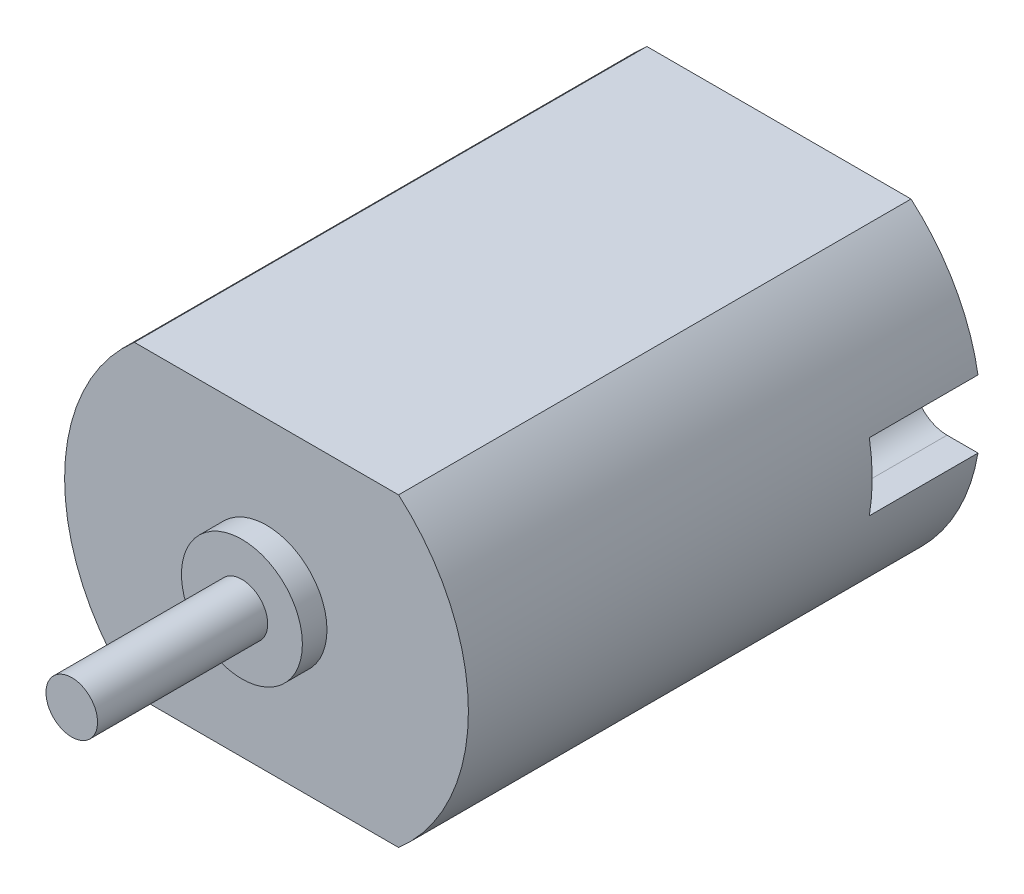
ISO-10303-21;
HEADER;
FILE_DESCRIPTION(('STEP AP214'),'2;1');
FILE_NAME('part.step','',(''),(''),'','','');
FILE_SCHEMA(('AUTOMOTIVE_DESIGN { 1 0 10303 214 1 1 1 1 }'));
ENDSEC;
DATA;
#1=APPLICATION_CONTEXT('core data for automotive mechanical design processes');
#2=APPLICATION_PROTOCOL_DEFINITION('international standard','automotive_design',2000,#1);
#3=PRODUCT_CONTEXT('',#1,'mechanical');
#4=PRODUCT('Part','Part','',(#3));
#5=PRODUCT_RELATED_PRODUCT_CATEGORY('part','',(#4));
#6=PRODUCT_DEFINITION_FORMATION('','',#4);
#7=PRODUCT_DEFINITION_CONTEXT('part definition',#1,'design');
#8=PRODUCT_DEFINITION('design','',#6,#7);
#9=PRODUCT_DEFINITION_SHAPE('','',#8);
#10=(LENGTH_UNIT() NAMED_UNIT(*) SI_UNIT(.MILLI.,.METRE.));
#11=(NAMED_UNIT(*) PLANE_ANGLE_UNIT() SI_UNIT($,.RADIAN.));
#12=(NAMED_UNIT(*) SI_UNIT($,.STERADIAN.) SOLID_ANGLE_UNIT());
#13=UNCERTAINTY_MEASURE_WITH_UNIT(LENGTH_MEASURE(1.E-05),#10,'distance_accuracy_value','');
#14=(GEOMETRIC_REPRESENTATION_CONTEXT(3) GLOBAL_UNCERTAINTY_ASSIGNED_CONTEXT((#13)) GLOBAL_UNIT_ASSIGNED_CONTEXT((#10,
#11,#12)) REPRESENTATION_CONTEXT('',''));
#15=CARTESIAN_POINT('',(0.,0.,0.));
#16=DIRECTION('',(0.,0.,1.));
#17=DIRECTION('',(1.,0.,0.));
#18=AXIS2_PLACEMENT_3D('',#15,#16,#17);
#19=CARTESIAN_POINT('',(0.,0.,0.));
#20=DIRECTION('',(0.,0.,1.));
#21=DIRECTION('',(1.,0.,0.));
#22=AXIS2_PLACEMENT_3D('',#19,#20,#21);
#23=PLANE('',#22);
#24=CARTESIAN_POINT('',(8.2,0.,0.));
#25=DIRECTION('',(0.,0.,-1.));
#26=DIRECTION('',(-1.,0.,0.));
#27=AXIS2_PLACEMENT_3D('',#24,#25,#26);
#28=CIRCLE('',#27,1.65);
#29=CARTESIAN_POINT('',(8.2,-1.65,0.));
#30=VERTEX_POINT('',#29);
#31=CARTESIAN_POINT('',(8.2,1.65,0.));
#32=VERTEX_POINT('',#31);
#33=EDGE_CURVE('E232',#30,#32,#28,.T.);
#34=ORIENTED_EDGE('',*,*,#33,.F.);
#35=DIRECTION('',(-1.,0.,0.));
#36=VECTOR('',#35,1.);
#37=CARTESIAN_POINT('',(9.71081870904817,-1.65,0.));
#38=LINE('',#37,#36);
#39=CARTESIAN_POINT('',(9.71081870904817,-1.65,0.));
#40=VERTEX_POINT('',#39);
#41=EDGE_CURVE('E223',#40,#30,#38,.T.);
#42=ORIENTED_EDGE('',*,*,#41,.F.);
#43=CARTESIAN_POINT('',(0.,0.,0.));
#44=DIRECTION('',(0.,0.,1.));
#45=DIRECTION('',(1.,0.,0.));
#46=AXIS2_PLACEMENT_3D('',#43,#44,#45);
#47=CIRCLE('',#46,9.85);
#48=CARTESIAN_POINT('',(6.44360147743481,-7.45,0.));
#49=VERTEX_POINT('',#48);
#50=EDGE_CURVE('E286',#49,#40,#47,.T.);
#51=ORIENTED_EDGE('',*,*,#50,.F.);
#52=DIRECTION('',(-1.,0.,0.));
#53=VECTOR('',#52,1.);
#54=CARTESIAN_POINT('',(0.,-7.45,0.));
#55=LINE('',#54,#53);
#56=CARTESIAN_POINT('',(-6.44360147743481,-7.45,0.));
#57=VERTEX_POINT('',#56);
#58=EDGE_CURVE('E300',#49,#57,#55,.T.);
#59=ORIENTED_EDGE('',*,*,#58,.T.);
#60=CARTESIAN_POINT('',(0.,0.,0.));
#61=DIRECTION('',(0.,0.,1.));
#62=DIRECTION('',(1.,0.,0.));
#63=AXIS2_PLACEMENT_3D('',#60,#61,#62);
#64=CIRCLE('',#63,9.85);
#65=CARTESIAN_POINT('',(-9.71081870904817,-1.65,0.));
#66=VERTEX_POINT('',#65);
#67=EDGE_CURVE('E296',#66,#57,#64,.T.);
#68=ORIENTED_EDGE('',*,*,#67,.F.);
#69=DIRECTION('',(-1.,0.,0.));
#70=VECTOR('',#69,1.);
#71=CARTESIAN_POINT('',(-8.2,-1.65,0.));
#72=LINE('',#71,#70);
#73=CARTESIAN_POINT('',(-8.2,-1.65,0.));
#74=VERTEX_POINT('',#73);
#75=EDGE_CURVE('E263',#74,#66,#72,.T.);
#76=ORIENTED_EDGE('',*,*,#75,.F.);
#77=CARTESIAN_POINT('',(-8.2,0.,0.));
#78=DIRECTION('',(0.,0.,-1.));
#79=DIRECTION('',(-1.,0.,0.));
#80=AXIS2_PLACEMENT_3D('',#77,#78,#79);
#81=CIRCLE('',#80,1.65);
#82=CARTESIAN_POINT('',(-8.2,1.65,0.));
#83=VERTEX_POINT('',#82);
#84=EDGE_CURVE('E218',#83,#74,#81,.T.);
#85=ORIENTED_EDGE('',*,*,#84,.F.);
#86=DIRECTION('',(1.,0.,0.));
#87=VECTOR('',#86,1.);
#88=CARTESIAN_POINT('',(-9.71081870904817,1.65,0.));
#89=LINE('',#88,#87);
#90=CARTESIAN_POINT('',(-9.71081870904817,1.65,0.));
#91=VERTEX_POINT('',#90);
#92=EDGE_CURVE('E253',#91,#83,#89,.T.);
#93=ORIENTED_EDGE('',*,*,#92,.F.);
#94=CARTESIAN_POINT('',(-6.44360147743481,7.45,0.));
#95=VERTEX_POINT('',#94);
#96=EDGE_CURVE('E297',#95,#91,#64,.T.);
#97=ORIENTED_EDGE('',*,*,#96,.F.);
#98=DIRECTION('',(-1.,0.,0.));
#99=VECTOR('',#98,1.);
#100=CARTESIAN_POINT('',(0.,7.45,0.));
#101=LINE('',#100,#99);
#102=CARTESIAN_POINT('',(6.44360147743481,7.45,0.));
#103=VERTEX_POINT('',#102);
#104=EDGE_CURVE('E277',#103,#95,#101,.T.);
#105=ORIENTED_EDGE('',*,*,#104,.F.);
#106=CARTESIAN_POINT('',(9.71081870904817,1.65,0.));
#107=VERTEX_POINT('',#106);
#108=EDGE_CURVE('E303',#107,#103,#47,.T.);
#109=ORIENTED_EDGE('',*,*,#108,.F.);
#110=DIRECTION('',(1.,0.,0.));
#111=VECTOR('',#110,1.);
#112=CARTESIAN_POINT('',(8.2,1.65,0.));
#113=LINE('',#112,#111);
#114=EDGE_CURVE('E234',#32,#107,#113,.T.);
#115=ORIENTED_EDGE('',*,*,#114,.F.);
#116=EDGE_LOOP('',(#34,#42,#51,#59,#68,#76,#85,#93,#97,#105,#109,#115));
#117=FACE_BOUND('',#116,.T.);
#118=CARTESIAN_POINT('',(0.,0.,0.));
#119=DIRECTION('',(0.,0.,-1.));
#120=DIRECTION('',(-1.,0.,0.));
#121=AXIS2_PLACEMENT_3D('',#118,#119,#120);
#122=CIRCLE('',#121,4.9);
#123=CARTESIAN_POINT('',(3.87427412556211,3.,0.));
#124=VERTEX_POINT('',#123);
#125=CARTESIAN_POINT('',(-3.8742741255621,3.,0.));
#126=VERTEX_POINT('',#125);
#127=EDGE_CURVE('E201',#124,#126,#122,.T.);
#128=ORIENTED_EDGE('',*,*,#127,.F.);
#129=DIRECTION('',(1.,0.,0.));
#130=VECTOR('',#129,1.);
#131=CARTESIAN_POINT('',(0.,3.,0.));
#132=LINE('',#131,#130);
#133=EDGE_CURVE('E61',#126,#124,#132,.T.);
#134=ORIENTED_EDGE('',*,*,#133,.F.);
#135=EDGE_LOOP('',(#128,#134));
#136=FACE_BOUND('',#135,.T.);
#137=ADVANCED_FACE('F38',(#117,#136),#23,.F.);
#138=CARTESIAN_POINT('',(0.,7.45,25.));
#139=DIRECTION('',(0.,-1.,0.));
#140=DIRECTION('',(0.,0.,-1.));
#141=AXIS2_PLACEMENT_3D('',#138,#139,#140);
#142=PLANE('',#141);
#143=ORIENTED_EDGE('',*,*,#104,.T.);
#144=DIRECTION('',(0.,0.,-1.));
#145=VECTOR('',#144,1.);
#146=CARTESIAN_POINT('',(-6.44360147743481,7.45,25.));
#147=LINE('',#146,#145);
#148=CARTESIAN_POINT('',(-6.44360147743481,7.45,25.));
#149=VERTEX_POINT('',#148);
#150=EDGE_CURVE('E281',#149,#95,#147,.T.);
#151=ORIENTED_EDGE('',*,*,#150,.F.);
#152=DIRECTION('',(-1.,0.,0.));
#153=VECTOR('',#152,1.);
#154=CARTESIAN_POINT('',(0.,7.45,25.));
#155=LINE('',#154,#153);
#156=CARTESIAN_POINT('',(6.44360147743481,7.45,25.));
#157=VERTEX_POINT('',#156);
#158=EDGE_CURVE('E282',#157,#149,#155,.T.);
#159=ORIENTED_EDGE('',*,*,#158,.F.);
#160=DIRECTION('',(0.,0.,-1.));
#161=VECTOR('',#160,1.);
#162=CARTESIAN_POINT('',(6.44360147743481,7.45,25.));
#163=LINE('',#162,#161);
#164=EDGE_CURVE('E293',#157,#103,#163,.T.);
#165=ORIENTED_EDGE('',*,*,#164,.T.);
#166=EDGE_LOOP('',(#143,#151,#159,#165));
#167=FACE_BOUND('',#166,.T.);
#168=ADVANCED_FACE('F40',(#167),#142,.F.);
#169=CARTESIAN_POINT('',(0.,0.,25.));
#170=DIRECTION('',(0.,0.,-1.));
#171=DIRECTION('',(-1.,0.,0.));
#172=AXIS2_PLACEMENT_3D('',#169,#170,#171);
#173=CYLINDRICAL_SURFACE('',#172,9.85);
#174=ORIENTED_EDGE('',*,*,#96,.T.);
#175=DIRECTION('',(0.,0.,-1.));
#176=VECTOR('',#175,1.);
#177=CARTESIAN_POINT('',(-9.71081870904817,1.65,5.3));
#178=LINE('',#177,#176);
#179=CARTESIAN_POINT('',(-9.71081870904817,1.65,5.3));
#180=VERTEX_POINT('',#179);
#181=EDGE_CURVE('E268',#180,#91,#178,.T.);
#182=ORIENTED_EDGE('',*,*,#181,.F.);
#183=CARTESIAN_POINT('',(0.,0.,5.3));
#184=DIRECTION('',(0.,0.,-1.));
#185=DIRECTION('',(-1.,0.,0.));
#186=AXIS2_PLACEMENT_3D('',#183,#184,#185);
#187=CIRCLE('',#186,9.85);
#188=CARTESIAN_POINT('',(-9.71081870904817,-1.65,5.3));
#189=VERTEX_POINT('',#188);
#190=EDGE_CURVE('E256',#189,#180,#187,.T.);
#191=ORIENTED_EDGE('',*,*,#190,.F.);
#192=DIRECTION('',(0.,0.,-1.));
#193=VECTOR('',#192,1.);
#194=CARTESIAN_POINT('',(-9.71081870904817,-1.65,5.3));
#195=LINE('',#194,#193);
#196=EDGE_CURVE('E270',#189,#66,#195,.T.);
#197=ORIENTED_EDGE('',*,*,#196,.T.);
#198=ORIENTED_EDGE('',*,*,#67,.T.);
#199=DIRECTION('',(0.,0.,-1.));
#200=VECTOR('',#199,1.);
#201=CARTESIAN_POINT('',(-6.44360147743481,-7.45,25.));
#202=LINE('',#201,#200);
#203=CARTESIAN_POINT('',(-6.44360147743481,-7.45,25.));
#204=VERTEX_POINT('',#203);
#205=EDGE_CURVE('E310',#204,#57,#202,.T.);
#206=ORIENTED_EDGE('',*,*,#205,.F.);
#207=CARTESIAN_POINT('',(0.,0.,25.));
#208=DIRECTION('',(0.,0.,1.));
#209=DIRECTION('',(1.,0.,0.));
#210=AXIS2_PLACEMENT_3D('',#207,#208,#209);
#211=CIRCLE('',#210,9.85);
#212=EDGE_CURVE('E285',#149,#204,#211,.T.);
#213=ORIENTED_EDGE('',*,*,#212,.F.);
#214=ORIENTED_EDGE('',*,*,#150,.T.);
#215=EDGE_LOOP('',(#174,#182,#191,#197,#198,#206,#213,#214));
#216=FACE_BOUND('',#215,.T.);
#217=ADVANCED_FACE('F315',(#216),#173,.T.);
#218=CARTESIAN_POINT('',(0.,-7.45,25.));
#219=DIRECTION('',(0.,-1.,0.));
#220=DIRECTION('',(0.,0.,-1.));
#221=AXIS2_PLACEMENT_3D('',#218,#219,#220);
#222=PLANE('',#221);
#223=ORIENTED_EDGE('',*,*,#58,.F.);
#224=DIRECTION('',(0.,0.,-1.));
#225=VECTOR('',#224,1.);
#226=CARTESIAN_POINT('',(6.44360147743481,-7.45,25.));
#227=LINE('',#226,#225);
#228=CARTESIAN_POINT('',(6.44360147743481,-7.45,25.));
#229=VERTEX_POINT('',#228);
#230=EDGE_CURVE('E308',#229,#49,#227,.T.);
#231=ORIENTED_EDGE('',*,*,#230,.F.);
#232=DIRECTION('',(-1.,0.,0.));
#233=VECTOR('',#232,1.);
#234=CARTESIAN_POINT('',(0.,-7.45,25.));
#235=LINE('',#234,#233);
#236=EDGE_CURVE('E288',#229,#204,#235,.T.);
#237=ORIENTED_EDGE('',*,*,#236,.T.);
#238=ORIENTED_EDGE('',*,*,#205,.T.);
#239=EDGE_LOOP('',(#223,#231,#237,#238));
#240=FACE_BOUND('',#239,.T.);
#241=ADVANCED_FACE('F343',(#240),#222,.T.);
#242=CARTESIAN_POINT('',(0.,0.,25.));
#243=DIRECTION('',(0.,0.,-1.));
#244=DIRECTION('',(-1.,0.,0.));
#245=AXIS2_PLACEMENT_3D('',#242,#243,#244);
#246=CYLINDRICAL_SURFACE('',#245,9.85);
#247=ORIENTED_EDGE('',*,*,#50,.T.);
#248=DIRECTION('',(0.,0.,-1.));
#249=VECTOR('',#248,1.);
#250=CARTESIAN_POINT('',(9.71081870904817,-1.65,5.3));
#251=LINE('',#250,#249);
#252=CARTESIAN_POINT('',(9.71081870904817,-1.65,5.3));
#253=VERTEX_POINT('',#252);
#254=EDGE_CURVE('E242',#253,#40,#251,.T.);
#255=ORIENTED_EDGE('',*,*,#254,.F.);
#256=CARTESIAN_POINT('',(0.,0.,5.3));
#257=DIRECTION('',(0.,0.,-1.));
#258=DIRECTION('',(-1.,0.,0.));
#259=AXIS2_PLACEMENT_3D('',#256,#257,#258);
#260=CIRCLE('',#259,9.85);
#261=CARTESIAN_POINT('',(9.71081870904817,1.65,5.3));
#262=VERTEX_POINT('',#261);
#263=EDGE_CURVE('E226',#262,#253,#260,.T.);
#264=ORIENTED_EDGE('',*,*,#263,.F.);
#265=DIRECTION('',(0.,0.,-1.));
#266=VECTOR('',#265,1.);
#267=CARTESIAN_POINT('',(9.71081870904817,1.65,5.3));
#268=LINE('',#267,#266);
#269=EDGE_CURVE('E244',#262,#107,#268,.T.);
#270=ORIENTED_EDGE('',*,*,#269,.T.);
#271=ORIENTED_EDGE('',*,*,#108,.T.);
#272=ORIENTED_EDGE('',*,*,#164,.F.);
#273=CARTESIAN_POINT('',(0.,0.,25.));
#274=DIRECTION('',(0.,0.,1.));
#275=DIRECTION('',(1.,0.,0.));
#276=AXIS2_PLACEMENT_3D('',#273,#274,#275);
#277=CIRCLE('',#276,9.85);
#278=EDGE_CURVE('E291',#229,#157,#277,.T.);
#279=ORIENTED_EDGE('',*,*,#278,.F.);
#280=ORIENTED_EDGE('',*,*,#230,.T.);
#281=EDGE_LOOP('',(#247,#255,#264,#270,#271,#272,#279,#280));
#282=FACE_BOUND('',#281,.T.);
#283=ADVANCED_FACE('F349',(#282),#246,.T.);
#284=CARTESIAN_POINT('',(0.,0.,25.));
#285=DIRECTION('',(0.,0.,1.));
#286=DIRECTION('',(1.,0.,0.));
#287=AXIS2_PLACEMENT_3D('',#284,#285,#286);
#288=PLANE('',#287);
#289=CARTESIAN_POINT('',(0.,0.,25.));
#290=DIRECTION('',(0.,0.,1.));
#291=DIRECTION('',(1.,0.,0.));
#292=AXIS2_PLACEMENT_3D('',#289,#290,#291);
#293=CIRCLE('',#292,2.95);
#294=CARTESIAN_POINT('',(2.95,0.,25.));
#295=VERTEX_POINT('',#294);
#296=EDGE_CURVE('E278',#295,#295,#293,.T.);
#297=ORIENTED_EDGE('',*,*,#296,.F.);
#298=EDGE_LOOP('',(#297));
#299=FACE_BOUND('',#298,.T.);
#300=ORIENTED_EDGE('',*,*,#158,.T.);
#301=ORIENTED_EDGE('',*,*,#212,.T.);
#302=ORIENTED_EDGE('',*,*,#236,.F.);
#303=ORIENTED_EDGE('',*,*,#278,.T.);
#304=EDGE_LOOP('',(#300,#301,#302,#303));
#305=FACE_BOUND('',#304,.T.);
#306=ADVANCED_FACE('F347',(#299,#305),#288,.T.);
#307=CARTESIAN_POINT('',(0.,0.,26.2));
#308=DIRECTION('',(0.,0.,-1.));
#309=DIRECTION('',(-1.,0.,0.));
#310=AXIS2_PLACEMENT_3D('',#307,#308,#309);
#311=CYLINDRICAL_SURFACE('',#310,2.95);
#312=CARTESIAN_POINT('',(0.,0.,26.2));
#313=DIRECTION('',(0.,0.,1.));
#314=DIRECTION('',(1.,0.,0.));
#315=AXIS2_PLACEMENT_3D('',#312,#313,#314);
#316=CIRCLE('',#315,2.95);
#317=CARTESIAN_POINT('',(2.95,0.,26.2));
#318=VERTEX_POINT('',#317);
#319=EDGE_CURVE('E241',#318,#318,#316,.T.);
#320=ORIENTED_EDGE('',*,*,#319,.F.);
#321=EDGE_LOOP('',(#320));
#322=FACE_BOUND('',#321,.T.);
#323=ORIENTED_EDGE('',*,*,#296,.T.);
#324=EDGE_LOOP('',(#323));
#325=FACE_BOUND('',#324,.T.);
#326=ADVANCED_FACE('F405',(#322,#325),#311,.T.);
#327=CARTESIAN_POINT('',(0.,0.,26.2));
#328=DIRECTION('',(0.,0.,1.));
#329=DIRECTION('',(1.,0.,0.));
#330=AXIS2_PLACEMENT_3D('',#327,#328,#329);
#331=PLANE('',#330);
#332=CARTESIAN_POINT('',(0.,0.,26.2));
#333=DIRECTION('',(0.,0.,1.));
#334=DIRECTION('',(1.,0.,0.));
#335=AXIS2_PLACEMENT_3D('',#332,#333,#334);
#336=CIRCLE('',#335,1.25739890475103);
#337=CARTESIAN_POINT('',(1.25739890475103,0.,26.2));
#338=VERTEX_POINT('',#337);
#339=EDGE_CURVE('E11',#338,#338,#336,.T.);
#340=ORIENTED_EDGE('',*,*,#339,.F.);
#341=EDGE_LOOP('',(#340));
#342=FACE_BOUND('',#341,.T.);
#343=ORIENTED_EDGE('',*,*,#319,.T.);
#344=EDGE_LOOP('',(#343));
#345=FACE_BOUND('',#344,.T.);
#346=ADVANCED_FACE('F411',(#342,#345),#331,.T.);
#347=CARTESIAN_POINT('',(-8.2,0.,5.3));
#348=DIRECTION('',(0.,0.,-1.));
#349=DIRECTION('',(-1.,0.,0.));
#350=AXIS2_PLACEMENT_3D('',#347,#348,#349);
#351=CYLINDRICAL_SURFACE('',#350,1.65);
#352=ORIENTED_EDGE('',*,*,#84,.T.);
#353=DIRECTION('',(0.,0.,-1.));
#354=VECTOR('',#353,1.);
#355=CARTESIAN_POINT('',(-8.2,-1.65,5.3));
#356=LINE('',#355,#354);
#357=CARTESIAN_POINT('',(-8.2,-1.65,5.3));
#358=VERTEX_POINT('',#357);
#359=EDGE_CURVE('E261',#358,#74,#356,.T.);
#360=ORIENTED_EDGE('',*,*,#359,.F.);
#361=CARTESIAN_POINT('',(-8.2,0.,5.3));
#362=DIRECTION('',(0.,0.,-1.));
#363=DIRECTION('',(-1.,0.,0.));
#364=AXIS2_PLACEMENT_3D('',#361,#362,#363);
#365=CIRCLE('',#364,1.65);
#366=CARTESIAN_POINT('',(-8.2,1.65,5.3));
#367=VERTEX_POINT('',#366);
#368=EDGE_CURVE('E249',#367,#358,#365,.T.);
#369=ORIENTED_EDGE('',*,*,#368,.F.);
#370=DIRECTION('',(0.,0.,-1.));
#371=VECTOR('',#370,1.);
#372=CARTESIAN_POINT('',(-8.2,1.65,5.3));
#373=LINE('',#372,#371);
#374=EDGE_CURVE('E235',#367,#83,#373,.T.);
#375=ORIENTED_EDGE('',*,*,#374,.T.);
#376=EDGE_LOOP('',(#352,#360,#369,#375));
#377=FACE_BOUND('',#376,.T.);
#378=ADVANCED_FACE('F418',(#377),#351,.F.);
#379=CARTESIAN_POINT('',(-9.71081870904817,1.65,5.3));
#380=DIRECTION('',(0.,1.,0.));
#381=DIRECTION('',(0.,0.,1.));
#382=AXIS2_PLACEMENT_3D('',#379,#380,#381);
#383=PLANE('',#382);
#384=ORIENTED_EDGE('',*,*,#92,.T.);
#385=ORIENTED_EDGE('',*,*,#374,.F.);
#386=DIRECTION('',(1.,0.,0.));
#387=VECTOR('',#386,1.);
#388=CARTESIAN_POINT('',(-9.71081870904817,1.65,5.3));
#389=LINE('',#388,#387);
#390=EDGE_CURVE('E258',#180,#367,#389,.T.);
#391=ORIENTED_EDGE('',*,*,#390,.F.);
#392=ORIENTED_EDGE('',*,*,#181,.T.);
#393=EDGE_LOOP('',(#384,#385,#391,#392));
#394=FACE_BOUND('',#393,.T.);
#395=ADVANCED_FACE('F330',(#394),#383,.F.);
#396=CARTESIAN_POINT('',(-8.2,-1.65,5.3));
#397=DIRECTION('',(0.,-1.,0.));
#398=DIRECTION('',(0.,0.,-1.));
#399=AXIS2_PLACEMENT_3D('',#396,#397,#398);
#400=PLANE('',#399);
#401=ORIENTED_EDGE('',*,*,#75,.T.);
#402=ORIENTED_EDGE('',*,*,#196,.F.);
#403=DIRECTION('',(-1.,0.,0.));
#404=VECTOR('',#403,1.);
#405=CARTESIAN_POINT('',(-8.2,-1.65,5.3));
#406=LINE('',#405,#404);
#407=EDGE_CURVE('E252',#358,#189,#406,.T.);
#408=ORIENTED_EDGE('',*,*,#407,.F.);
#409=ORIENTED_EDGE('',*,*,#359,.T.);
#410=EDGE_LOOP('',(#401,#402,#408,#409));
#411=FACE_BOUND('',#410,.T.);
#412=ADVANCED_FACE('F339',(#411),#400,.F.);
#413=CARTESIAN_POINT('',(-8.2,0.,5.3));
#414=DIRECTION('',(0.,0.,-1.));
#415=DIRECTION('',(-1.,0.,0.));
#416=AXIS2_PLACEMENT_3D('',#413,#414,#415);
#417=PLANE('',#416);
#418=ORIENTED_EDGE('',*,*,#368,.T.);
#419=ORIENTED_EDGE('',*,*,#407,.T.);
#420=ORIENTED_EDGE('',*,*,#190,.T.);
#421=ORIENTED_EDGE('',*,*,#390,.T.);
#422=EDGE_LOOP('',(#418,#419,#420,#421));
#423=FACE_BOUND('',#422,.T.);
#424=ADVANCED_FACE('F336',(#423),#417,.T.);
#425=CARTESIAN_POINT('',(8.2,0.,5.3));
#426=DIRECTION('',(0.,0.,-1.));
#427=DIRECTION('',(-1.,0.,0.));
#428=AXIS2_PLACEMENT_3D('',#425,#426,#427);
#429=CYLINDRICAL_SURFACE('',#428,1.65);
#430=ORIENTED_EDGE('',*,*,#33,.T.);
#431=DIRECTION('',(0.,0.,-1.));
#432=VECTOR('',#431,1.);
#433=CARTESIAN_POINT('',(8.2,1.65,5.3));
#434=LINE('',#433,#432);
#435=CARTESIAN_POINT('',(8.2,1.65,5.3));
#436=VERTEX_POINT('',#435);
#437=EDGE_CURVE('E231',#436,#32,#434,.T.);
#438=ORIENTED_EDGE('',*,*,#437,.F.);
#439=CARTESIAN_POINT('',(8.2,0.,5.3));
#440=DIRECTION('',(0.,0.,-1.));
#441=DIRECTION('',(-1.,0.,0.));
#442=AXIS2_PLACEMENT_3D('',#439,#440,#441);
#443=CIRCLE('',#442,1.65);
#444=CARTESIAN_POINT('',(8.2,-1.65,5.3));
#445=VERTEX_POINT('',#444);
#446=EDGE_CURVE('E219',#445,#436,#443,.T.);
#447=ORIENTED_EDGE('',*,*,#446,.F.);
#448=DIRECTION('',(0.,0.,-1.));
#449=VECTOR('',#448,1.);
#450=CARTESIAN_POINT('',(8.2,-1.65,5.3));
#451=LINE('',#450,#449);
#452=EDGE_CURVE('E239',#445,#30,#451,.T.);
#453=ORIENTED_EDGE('',*,*,#452,.T.);
#454=EDGE_LOOP('',(#430,#438,#447,#453));
#455=FACE_BOUND('',#454,.T.);
#456=ADVANCED_FACE('F360',(#455),#429,.F.);
#457=CARTESIAN_POINT('',(9.71081870904817,-1.65,5.3));
#458=DIRECTION('',(0.,-1.,0.));
#459=DIRECTION('',(0.,0.,-1.));
#460=AXIS2_PLACEMENT_3D('',#457,#458,#459);
#461=PLANE('',#460);
#462=ORIENTED_EDGE('',*,*,#41,.T.);
#463=ORIENTED_EDGE('',*,*,#452,.F.);
#464=DIRECTION('',(-1.,0.,0.));
#465=VECTOR('',#464,1.);
#466=CARTESIAN_POINT('',(9.71081870904817,-1.65,5.3));
#467=LINE('',#466,#465);
#468=EDGE_CURVE('E228',#253,#445,#467,.T.);
#469=ORIENTED_EDGE('',*,*,#468,.F.);
#470=ORIENTED_EDGE('',*,*,#254,.T.);
#471=EDGE_LOOP('',(#462,#463,#469,#470));
#472=FACE_BOUND('',#471,.T.);
#473=ADVANCED_FACE('F363',(#472),#461,.F.);
#474=CARTESIAN_POINT('',(8.2,1.65,5.3));
#475=DIRECTION('',(0.,1.,0.));
#476=DIRECTION('',(0.,0.,1.));
#477=AXIS2_PLACEMENT_3D('',#474,#475,#476);
#478=PLANE('',#477);
#479=ORIENTED_EDGE('',*,*,#114,.T.);
#480=ORIENTED_EDGE('',*,*,#269,.F.);
#481=DIRECTION('',(1.,0.,0.));
#482=VECTOR('',#481,1.);
#483=CARTESIAN_POINT('',(8.2,1.65,5.3));
#484=LINE('',#483,#482);
#485=EDGE_CURVE('E222',#436,#262,#484,.T.);
#486=ORIENTED_EDGE('',*,*,#485,.F.);
#487=ORIENTED_EDGE('',*,*,#437,.T.);
#488=EDGE_LOOP('',(#479,#480,#486,#487));
#489=FACE_BOUND('',#488,.T.);
#490=ADVANCED_FACE('F354',(#489),#478,.F.);
#491=CARTESIAN_POINT('',(8.2,0.,5.3));
#492=DIRECTION('',(0.,0.,-1.));
#493=DIRECTION('',(-1.,0.,0.));
#494=AXIS2_PLACEMENT_3D('',#491,#492,#493);
#495=PLANE('',#494);
#496=ORIENTED_EDGE('',*,*,#446,.T.);
#497=ORIENTED_EDGE('',*,*,#485,.T.);
#498=ORIENTED_EDGE('',*,*,#263,.T.);
#499=ORIENTED_EDGE('',*,*,#468,.T.);
#500=EDGE_LOOP('',(#496,#497,#498,#499));
#501=FACE_BOUND('',#500,.T.);
#502=ADVANCED_FACE('F356',(#501),#495,.T.);
#503=CARTESIAN_POINT('',(0.,0.,-2.4));
#504=DIRECTION('',(0.,0.,1.));
#505=DIRECTION('',(1.,0.,0.));
#506=AXIS2_PLACEMENT_3D('',#503,#504,#505);
#507=CYLINDRICAL_SURFACE('',#506,4.9);
#508=ORIENTED_EDGE('',*,*,#127,.T.);
#509=DIRECTION('',(0.,0.,1.));
#510=VECTOR('',#509,1.);
#511=CARTESIAN_POINT('',(-3.8742741255621,3.,-2.4));
#512=LINE('',#511,#510);
#513=CARTESIAN_POINT('',(-3.8742741255621,3.,-2.4));
#514=VERTEX_POINT('',#513);
#515=EDGE_CURVE('E216',#514,#126,#512,.T.);
#516=ORIENTED_EDGE('',*,*,#515,.F.);
#517=CARTESIAN_POINT('',(0.,0.,-2.4));
#518=DIRECTION('',(0.,0.,-1.));
#519=DIRECTION('',(-1.,0.,0.));
#520=AXIS2_PLACEMENT_3D('',#517,#518,#519);
#521=CIRCLE('',#520,4.9);
#522=CARTESIAN_POINT('',(3.87427412556211,3.,-2.4));
#523=VERTEX_POINT('',#522);
#524=EDGE_CURVE('E205',#523,#514,#521,.T.);
#525=ORIENTED_EDGE('',*,*,#524,.F.);
#526=DIRECTION('',(0.,0.,1.));
#527=VECTOR('',#526,1.);
#528=CARTESIAN_POINT('',(3.87427412556211,3.,-2.4));
#529=LINE('',#528,#527);
#530=EDGE_CURVE('E210',#523,#124,#529,.T.);
#531=ORIENTED_EDGE('',*,*,#530,.T.);
#532=EDGE_LOOP('',(#508,#516,#525,#531));
#533=FACE_BOUND('',#532,.T.);
#534=ADVANCED_FACE('F468',(#533),#507,.T.);
#535=CARTESIAN_POINT('',(0.,3.,-2.4));
#536=DIRECTION('',(0.,-1.,0.));
#537=DIRECTION('',(0.,0.,-1.));
#538=AXIS2_PLACEMENT_3D('',#535,#536,#537);
#539=PLANE('',#538);
#540=ORIENTED_EDGE('',*,*,#133,.T.);
#541=ORIENTED_EDGE('',*,*,#530,.F.);
#542=DIRECTION('',(1.,0.,0.));
#543=VECTOR('',#542,1.);
#544=CARTESIAN_POINT('',(0.,3.,-2.4));
#545=LINE('',#544,#543);
#546=EDGE_CURVE('E208',#514,#523,#545,.T.);
#547=ORIENTED_EDGE('',*,*,#546,.F.);
#548=ORIENTED_EDGE('',*,*,#515,.T.);
#549=EDGE_LOOP('',(#540,#541,#547,#548));
#550=FACE_BOUND('',#549,.T.);
#551=ADVANCED_FACE('F481',(#550),#539,.F.);
#552=CARTESIAN_POINT('',(0.,0.,-2.4));
#553=DIRECTION('',(0.,0.,-1.));
#554=DIRECTION('',(-1.,0.,0.));
#555=AXIS2_PLACEMENT_3D('',#552,#553,#554);
#556=PLANE('',#555);
#557=CARTESIAN_POINT('',(0.,0.,-2.4));
#558=DIRECTION('',(0.,0.,-1.));
#559=DIRECTION('',(-1.,0.,0.));
#560=AXIS2_PLACEMENT_3D('',#557,#558,#559);
#561=CIRCLE('',#560,1.25739890475103);
#562=CARTESIAN_POINT('',(-1.25739890475103,0.,-2.4));
#563=VERTEX_POINT('',#562);
#564=EDGE_CURVE('E42',#563,#563,#561,.T.);
#565=ORIENTED_EDGE('',*,*,#564,.F.);
#566=EDGE_LOOP('',(#565));
#567=FACE_BOUND('',#566,.T.);
#568=DIRECTION('',(-1.,0.,0.));
#569=VECTOR('',#568,1.);
#570=CARTESIAN_POINT('',(0.,-3.,-2.4));
#571=LINE('',#570,#569);
#572=CARTESIAN_POINT('',(3.,-3.,-2.4));
#573=VERTEX_POINT('',#572);
#574=CARTESIAN_POINT('',(-3.,-3.,-2.4));
#575=VERTEX_POINT('',#574);
#576=EDGE_CURVE('E168',#573,#575,#571,.T.);
#577=ORIENTED_EDGE('',*,*,#576,.F.);
#578=DIRECTION('',(0.,-1.,0.));
#579=VECTOR('',#578,1.);
#580=CARTESIAN_POINT('',(3.,-3.,-2.4));
#581=LINE('',#580,#579);
#582=CARTESIAN_POINT('',(3.,-1.8,-2.4));
#583=VERTEX_POINT('',#582);
#584=EDGE_CURVE('E185',#583,#573,#581,.T.);
#585=ORIENTED_EDGE('',*,*,#584,.F.);
#586=DIRECTION('',(1.,0.,0.));
#587=VECTOR('',#586,1.);
#588=CARTESIAN_POINT('',(3.,-1.8,-2.4));
#589=LINE('',#588,#587);
#590=CARTESIAN_POINT('',(-3.,-1.8,-2.4));
#591=VERTEX_POINT('',#590);
#592=EDGE_CURVE('E193',#591,#583,#589,.T.);
#593=ORIENTED_EDGE('',*,*,#592,.F.);
#594=DIRECTION('',(0.,1.,0.));
#595=VECTOR('',#594,1.);
#596=CARTESIAN_POINT('',(-3.,-1.8,-2.4));
#597=LINE('',#596,#595);
#598=EDGE_CURVE('E191',#575,#591,#597,.T.);
#599=ORIENTED_EDGE('',*,*,#598,.F.);
#600=EDGE_LOOP('',(#577,#585,#593,#599));
#601=FACE_BOUND('',#600,.T.);
#602=ORIENTED_EDGE('',*,*,#524,.T.);
#603=ORIENTED_EDGE('',*,*,#546,.T.);
#604=EDGE_LOOP('',(#602,#603));
#605=FACE_BOUND('',#604,.T.);
#606=ADVANCED_FACE('F492',(#567,#601,#605),#556,.T.);
#607=CARTESIAN_POINT('',(0.,-3.,0.1));
#608=DIRECTION('',(0.,-1.,0.));
#609=DIRECTION('',(1.,0.,0.));
#610=AXIS2_PLACEMENT_3D('',#607,#608,#609);
#611=PLANE('',#610);
#612=ORIENTED_EDGE('',*,*,#576,.T.);
#613=DIRECTION('',(0.,0.,-1.));
#614=VECTOR('',#613,1.);
#615=CARTESIAN_POINT('',(-3.,-3.,0.1));
#616=LINE('',#615,#614);
#617=CARTESIAN_POINT('',(-3.,-3.,0.1));
#618=VERTEX_POINT('',#617);
#619=EDGE_CURVE('E54',#618,#575,#616,.T.);
#620=ORIENTED_EDGE('',*,*,#619,.F.);
#621=DIRECTION('',(-1.,0.,0.));
#622=VECTOR('',#621,1.);
#623=CARTESIAN_POINT('',(-3.,-3.,0.1));
#624=LINE('',#623,#622);
#625=CARTESIAN_POINT('',(3.,-3.,0.1));
#626=VERTEX_POINT('',#625);
#627=EDGE_CURVE('E165',#626,#618,#624,.T.);
#628=ORIENTED_EDGE('',*,*,#627,.F.);
#629=DIRECTION('',(0.,0.,-1.));
#630=VECTOR('',#629,1.);
#631=CARTESIAN_POINT('',(3.,-3.,0.1));
#632=LINE('',#631,#630);
#633=EDGE_CURVE('E199',#626,#573,#632,.T.);
#634=ORIENTED_EDGE('',*,*,#633,.T.);
#635=EDGE_LOOP('',(#612,#620,#628,#634));
#636=FACE_BOUND('',#635,.T.);
#637=ADVANCED_FACE('F163',(#636),#611,.F.);
#638=CARTESIAN_POINT('',(3.,-3.,0.1));
#639=DIRECTION('',(1.,0.,0.));
#640=DIRECTION('',(0.,0.,-1.));
#641=AXIS2_PLACEMENT_3D('',#638,#639,#640);
#642=PLANE('',#641);
#643=ORIENTED_EDGE('',*,*,#584,.T.);
#644=ORIENTED_EDGE('',*,*,#633,.F.);
#645=DIRECTION('',(0.,-1.,0.));
#646=VECTOR('',#645,1.);
#647=CARTESIAN_POINT('',(3.,-3.,0.1));
#648=LINE('',#647,#646);
#649=CARTESIAN_POINT('',(3.,-1.8,0.1));
#650=VERTEX_POINT('',#649);
#651=EDGE_CURVE('E171',#650,#626,#648,.T.);
#652=ORIENTED_EDGE('',*,*,#651,.F.);
#653=DIRECTION('',(0.,0.,-1.));
#654=VECTOR('',#653,1.);
#655=CARTESIAN_POINT('',(3.,-1.8,0.1));
#656=LINE('',#655,#654);
#657=EDGE_CURVE('E202',#650,#583,#656,.T.);
#658=ORIENTED_EDGE('',*,*,#657,.T.);
#659=EDGE_LOOP('',(#643,#644,#652,#658));
#660=FACE_BOUND('',#659,.T.);
#661=ADVANCED_FACE('F504',(#660),#642,.F.);
#662=CARTESIAN_POINT('',(3.,-1.8,0.1));
#663=DIRECTION('',(0.,1.,0.));
#664=DIRECTION('',(0.,0.,1.));
#665=AXIS2_PLACEMENT_3D('',#662,#663,#664);
#666=PLANE('',#665);
#667=ORIENTED_EDGE('',*,*,#592,.T.);
#668=ORIENTED_EDGE('',*,*,#657,.F.);
#669=DIRECTION('',(1.,0.,0.));
#670=VECTOR('',#669,1.);
#671=CARTESIAN_POINT('',(3.,-1.8,0.1));
#672=LINE('',#671,#670);
#673=CARTESIAN_POINT('',(-3.,-1.8,0.1));
#674=VERTEX_POINT('',#673);
#675=EDGE_CURVE('E179',#674,#650,#672,.T.);
#676=ORIENTED_EDGE('',*,*,#675,.F.);
#677=DIRECTION('',(0.,0.,-1.));
#678=VECTOR('',#677,1.);
#679=CARTESIAN_POINT('',(-3.,-1.8,0.1));
#680=LINE('',#679,#678);
#681=EDGE_CURVE('E170',#674,#591,#680,.T.);
#682=ORIENTED_EDGE('',*,*,#681,.T.);
#683=EDGE_LOOP('',(#667,#668,#676,#682));
#684=FACE_BOUND('',#683,.T.);
#685=ADVANCED_FACE('F514',(#684),#666,.F.);
#686=CARTESIAN_POINT('',(-3.,-1.8,0.1));
#687=DIRECTION('',(-1.,0.,0.));
#688=DIRECTION('',(0.,-1.,0.));
#689=AXIS2_PLACEMENT_3D('',#686,#687,#688);
#690=PLANE('',#689);
#691=ORIENTED_EDGE('',*,*,#598,.T.);
#692=ORIENTED_EDGE('',*,*,#681,.F.);
#693=DIRECTION('',(0.,1.,0.));
#694=VECTOR('',#693,1.);
#695=CARTESIAN_POINT('',(-3.,-1.8,0.1));
#696=LINE('',#695,#694);
#697=EDGE_CURVE('E174',#618,#674,#696,.T.);
#698=ORIENTED_EDGE('',*,*,#697,.F.);
#699=ORIENTED_EDGE('',*,*,#619,.T.);
#700=EDGE_LOOP('',(#691,#692,#698,#699));
#701=FACE_BOUND('',#700,.T.);
#702=ADVANCED_FACE('F175',(#701),#690,.F.);
#703=CARTESIAN_POINT('',(0.,0.,0.1));
#704=DIRECTION('',(0.,0.,1.));
#705=DIRECTION('',(1.,0.,0.));
#706=AXIS2_PLACEMENT_3D('',#703,#704,#705);
#707=PLANE('',#706);
#708=ORIENTED_EDGE('',*,*,#627,.T.);
#709=ORIENTED_EDGE('',*,*,#697,.T.);
#710=ORIENTED_EDGE('',*,*,#675,.T.);
#711=ORIENTED_EDGE('',*,*,#651,.T.);
#712=EDGE_LOOP('',(#708,#709,#710,#711));
#713=FACE_BOUND('',#712,.T.);
#714=ADVANCED_FACE('F182',(#713),#707,.F.);
#715=CARTESIAN_POINT('',(0.,0.,-3.5));
#716=DIRECTION('',(0.,0.,-1.));
#717=DIRECTION('',(-1.,0.,0.));
#718=AXIS2_PLACEMENT_3D('',#715,#716,#717);
#719=PLANE('',#718);
#720=CARTESIAN_POINT('',(0.,0.,-3.5));
#721=DIRECTION('',(0.,0.,-1.));
#722=DIRECTION('',(-1.,0.,0.));
#723=AXIS2_PLACEMENT_3D('',#720,#721,#722);
#724=CIRCLE('',#723,1.25739890475103);
#725=CARTESIAN_POINT('',(-1.25739890475103,0.,-3.5));
#726=VERTEX_POINT('',#725);
#727=EDGE_CURVE('E598',#726,#726,#724,.T.);
#728=ORIENTED_EDGE('',*,*,#727,.T.);
#729=EDGE_LOOP('',(#728));
#730=FACE_BOUND('',#729,.T.);
#731=ADVANCED_FACE('F539',(#730),#719,.T.);
#732=CARTESIAN_POINT('',(0.,0.,34.5));
#733=DIRECTION('',(0.,0.,-1.));
#734=DIRECTION('',(-1.,0.,0.));
#735=AXIS2_PLACEMENT_3D('',#732,#733,#734);
#736=CYLINDRICAL_SURFACE('',#735,1.25739890475103);
#737=ORIENTED_EDGE('',*,*,#564,.T.);
#738=EDGE_LOOP('',(#737));
#739=FACE_BOUND('',#738,.T.);
#740=ORIENTED_EDGE('',*,*,#727,.F.);
#741=EDGE_LOOP('',(#740));
#742=FACE_BOUND('',#741,.T.);
#743=ADVANCED_FACE('F549',(#739,#742),#736,.T.);
#744=ORIENTED_EDGE('',*,*,#339,.T.);
#745=EDGE_LOOP('',(#744));
#746=FACE_BOUND('',#745,.T.);
#747=CARTESIAN_POINT('',(0.,0.,34.5));
#748=DIRECTION('',(0.,0.,-1.));
#749=DIRECTION('',(-1.,0.,0.));
#750=AXIS2_PLACEMENT_3D('',#747,#748,#749);
#751=CIRCLE('',#750,1.25739890475103);
#752=CARTESIAN_POINT('',(-1.25739890475103,0.,34.5));
#753=VERTEX_POINT('',#752);
#754=EDGE_CURVE('E194',#753,#753,#751,.T.);
#755=ORIENTED_EDGE('',*,*,#754,.T.);
#756=EDGE_LOOP('',(#755));
#757=FACE_BOUND('',#756,.T.);
#758=ADVANCED_FACE('F556',(#746,#757),#736,.T.);
#759=CARTESIAN_POINT('',(0.,0.,34.5));
#760=DIRECTION('',(0.,0.,-1.));
#761=DIRECTION('',(-1.,0.,0.));
#762=AXIS2_PLACEMENT_3D('',#759,#760,#761);
#763=PLANE('',#762);
#764=ORIENTED_EDGE('',*,*,#754,.F.);
#765=EDGE_LOOP('',(#764));
#766=FACE_BOUND('',#765,.T.);
#767=ADVANCED_FACE('F564',(#766),#763,.F.);
#768=CLOSED_SHELL('',(#137,#168,#217,#241,#283,#306,#326,#346,#378,#395,#412,#424,#456,#473,
#490,#502,#534,#551,#606,#637,#661,#685,#702,#714,#731,#743,#758,#767));
#769=MANIFOLD_SOLID_BREP('B2',#768);
#770=ADVANCED_BREP_SHAPE_REPRESENTATION('',(#18,#769),#14);
#771=SHAPE_DEFINITION_REPRESENTATION(#9,#770);
ENDSEC;
END-ISO-10303-21;
